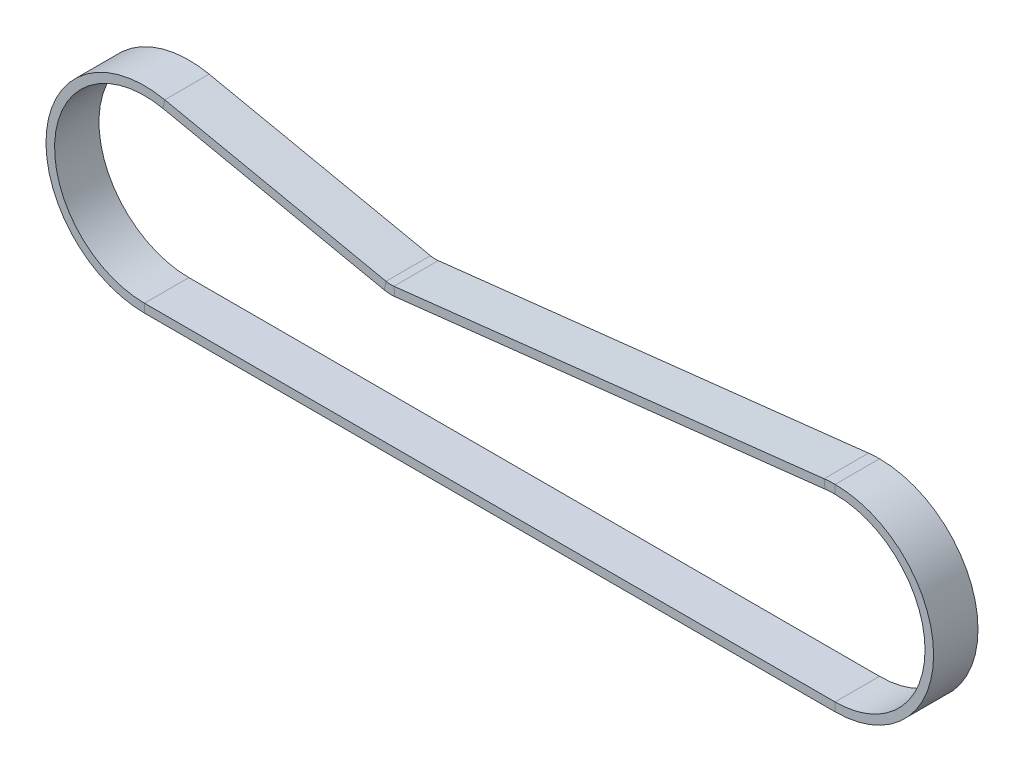
ISO-10303-21;
HEADER;
FILE_DESCRIPTION(('STEP AP214'),'2;1');
FILE_NAME('part.step','',(''),(''),'','','');
FILE_SCHEMA(('AUTOMOTIVE_DESIGN { 1 0 10303 214 1 1 1 1 }'));
ENDSEC;
DATA;
#1=APPLICATION_CONTEXT('core data for automotive mechanical design processes');
#2=APPLICATION_PROTOCOL_DEFINITION('international standard','automotive_design',2000,#1);
#3=PRODUCT_CONTEXT('',#1,'mechanical');
#4=PRODUCT('Part','Part','',(#3));
#5=PRODUCT_RELATED_PRODUCT_CATEGORY('part','',(#4));
#6=PRODUCT_DEFINITION_FORMATION('','',#4);
#7=PRODUCT_DEFINITION_CONTEXT('part definition',#1,'design');
#8=PRODUCT_DEFINITION('design','',#6,#7);
#9=PRODUCT_DEFINITION_SHAPE('','',#8);
#10=(LENGTH_UNIT() NAMED_UNIT(*) SI_UNIT(.MILLI.,.METRE.));
#11=(NAMED_UNIT(*) PLANE_ANGLE_UNIT() SI_UNIT($,.RADIAN.));
#12=(NAMED_UNIT(*) SI_UNIT($,.STERADIAN.) SOLID_ANGLE_UNIT());
#13=UNCERTAINTY_MEASURE_WITH_UNIT(LENGTH_MEASURE(1.E-05),#10,'distance_accuracy_value','');
#14=(GEOMETRIC_REPRESENTATION_CONTEXT(3) GLOBAL_UNCERTAINTY_ASSIGNED_CONTEXT((#13)) GLOBAL_UNIT_ASSIGNED_CONTEXT((#10,
#11,#12)) REPRESENTATION_CONTEXT('',''));
#15=CARTESIAN_POINT('',(0.,0.,0.));
#16=DIRECTION('',(0.,0.,1.));
#17=DIRECTION('',(1.,0.,0.));
#18=AXIS2_PLACEMENT_3D('',#15,#16,#17);
#19=CARTESIAN_POINT('',(0.,0.,0.));
#20=DIRECTION('',(0.,0.,-1.));
#21=DIRECTION('',(-1.,0.,0.));
#22=AXIS2_PLACEMENT_3D('',#19,#20,#21);
#23=CYLINDRICAL_SURFACE('',#22,18.2285931710274);
#24=CARTESIAN_POINT('',(0.,0.,4.50000000000002));
#25=DIRECTION('',(0.,0.,-1.));
#26=DIRECTION('',(-0.111807159238681,0.993729922636415,0.));
#27=AXIS2_PLACEMENT_3D('',#24,#25,#26);
#28=CIRCLE('',#27,18.2285931710274);
#29=CARTESIAN_POINT('',(-2.03808721937022,18.1142984816158,4.50000000000002));
#30=VERTEX_POINT('',#29);
#31=CARTESIAN_POINT('',(0.,18.2285931710274,4.50000000000002));
#32=VERTEX_POINT('',#31);
#33=EDGE_CURVE('E11',#30,#32,#28,.T.);
#34=ORIENTED_EDGE('',*,*,#33,.F.);
#35=DIRECTION('',(0.,0.,-1.));
#36=VECTOR('',#35,1.);
#37=CARTESIAN_POINT('',(-2.0380872193702,18.1142984816158,-4.49999999999998));
#38=LINE('',#37,#36);
#39=CARTESIAN_POINT('',(-2.03808721937022,18.1142984816158,-4.49999999999998));
#40=VERTEX_POINT('',#39);
#41=EDGE_CURVE('E42',#30,#40,#38,.T.);
#42=ORIENTED_EDGE('',*,*,#41,.T.);
#43=CARTESIAN_POINT('',(0.,0.,-4.49999999999998));
#44=DIRECTION('',(0.,0.,-1.));
#45=DIRECTION('',(-0.111807159238681,0.993729922636415,0.));
#46=AXIS2_PLACEMENT_3D('',#43,#44,#45);
#47=CIRCLE('',#46,18.2285931710274);
#48=CARTESIAN_POINT('',(0.,18.2285931710274,-4.49999999999998));
#49=VERTEX_POINT('',#48);
#50=EDGE_CURVE('E163',#40,#49,#47,.T.);
#51=ORIENTED_EDGE('',*,*,#50,.T.);
#52=DIRECTION('',(0.,0.,-1.));
#53=VECTOR('',#52,1.);
#54=CARTESIAN_POINT('',(0.,18.2285931710274,-4.49999999999998));
#55=LINE('',#54,#53);
#56=EDGE_CURVE('E166',#32,#49,#55,.T.);
#57=ORIENTED_EDGE('',*,*,#56,.F.);
#58=EDGE_LOOP('',(#34,#42,#51,#57));
#59=FACE_BOUND('',#58,.T.);
#60=ADVANCED_FACE('F39',(#59),#23,.F.);
#61=CARTESIAN_POINT('',(-2.0380872193702,18.1142984816158,4.50000000000002));
#62=DIRECTION('',(0.,0.,1.));
#63=DIRECTION('',(1.,0.,0.));
#64=AXIS2_PLACEMENT_3D('',#61,#62,#63);
#65=PLANE('',#64);
#66=CARTESIAN_POINT('',(0.,0.,4.50000000000002));
#67=DIRECTION('',(0.,0.,-1.));
#68=DIRECTION('',(-0.111807159238681,0.993729922636415,0.));
#69=AXIS2_PLACEMENT_3D('',#66,#67,#68);
#70=CIRCLE('',#69,19.9685931710274);
#71=CARTESIAN_POINT('',(-2.23263167644552,19.8433885470031,4.50000000000002));
#72=VERTEX_POINT('',#71);
#73=CARTESIAN_POINT('',(0.,19.9685931710274,4.50000000000002));
#74=VERTEX_POINT('',#73);
#75=EDGE_CURVE('E47',#72,#74,#70,.T.);
#76=ORIENTED_EDGE('',*,*,#75,.F.);
#77=DIRECTION('',(0.111807159238681,-0.993729922636415,0.));
#78=VECTOR('',#77,1.);
#79=CARTESIAN_POINT('',(-2.0380872193702,18.1142984816158,4.50000000000002));
#80=LINE('',#79,#78);
#81=EDGE_CURVE('E282',#72,#30,#80,.T.);
#82=ORIENTED_EDGE('',*,*,#81,.T.);
#83=ORIENTED_EDGE('',*,*,#33,.T.);
#84=DIRECTION('',(0.,-1.,0.));
#85=VECTOR('',#84,1.);
#86=CARTESIAN_POINT('',(0.,18.2285931710274,4.50000000000002));
#87=LINE('',#86,#85);
#88=EDGE_CURVE('E191',#74,#32,#87,.T.);
#89=ORIENTED_EDGE('',*,*,#88,.F.);
#90=EDGE_LOOP('',(#76,#82,#83,#89));
#91=FACE_BOUND('',#90,.T.);
#92=ADVANCED_FACE('F377',(#91),#65,.T.);
#93=CARTESIAN_POINT('',(0.,0.,0.));
#94=DIRECTION('',(0.,0.,-1.));
#95=DIRECTION('',(-1.,0.,0.));
#96=AXIS2_PLACEMENT_3D('',#93,#94,#95);
#97=CYLINDRICAL_SURFACE('',#96,19.9685931710274);
#98=CARTESIAN_POINT('',(0.,0.,-4.49999999999998));
#99=DIRECTION('',(0.,0.,-1.));
#100=DIRECTION('',(-0.111807159238681,0.993729922636415,0.));
#101=AXIS2_PLACEMENT_3D('',#98,#99,#100);
#102=CIRCLE('',#101,19.9685931710274);
#103=CARTESIAN_POINT('',(-2.23263167644552,19.8433885470031,-4.49999999999998));
#104=VERTEX_POINT('',#103);
#105=CARTESIAN_POINT('',(0.,19.9685931710274,-4.49999999999998));
#106=VERTEX_POINT('',#105);
#107=EDGE_CURVE('E172',#104,#106,#102,.T.);
#108=ORIENTED_EDGE('',*,*,#107,.F.);
#109=DIRECTION('',(0.,0.,1.));
#110=VECTOR('',#109,1.);
#111=CARTESIAN_POINT('',(-2.23263167644551,19.8433885470031,-4.49999999999998));
#112=LINE('',#111,#110);
#113=EDGE_CURVE('E250',#104,#72,#112,.T.);
#114=ORIENTED_EDGE('',*,*,#113,.T.);
#115=ORIENTED_EDGE('',*,*,#75,.T.);
#116=DIRECTION('',(0.,0.,1.));
#117=VECTOR('',#116,1.);
#118=CARTESIAN_POINT('',(0.,19.9685931710274,-4.49999999999998));
#119=LINE('',#118,#117);
#120=EDGE_CURVE('E195',#106,#74,#119,.T.);
#121=ORIENTED_EDGE('',*,*,#120,.F.);
#122=EDGE_LOOP('',(#108,#114,#115,#121));
#123=FACE_BOUND('',#122,.T.);
#124=ADVANCED_FACE('F381',(#123),#97,.T.);
#125=CARTESIAN_POINT('',(-89.2464197467303,8.30226032143054,-4.49999999999998));
#126=DIRECTION('',(0.111807159238681,-0.993729922636415,0.));
#127=DIRECTION('',(0.993729922636416,0.111807159238682,0.));
#128=AXIS2_PLACEMENT_3D('',#125,#126,#127);
#129=PLANE('',#128);
#130=ORIENTED_EDGE('',*,*,#41,.F.);
#131=DIRECTION('',(0.993729922636415,0.111807159238681,0.));
#132=VECTOR('',#131,1.);
#133=CARTESIAN_POINT('',(-89.2464197467303,8.30226032143054,4.50000000000002));
#134=LINE('',#133,#132);
#135=CARTESIAN_POINT('',(-89.2464197467303,8.30226032143055,4.50000000000002));
#136=VERTEX_POINT('',#135);
#137=EDGE_CURVE('E98',#136,#30,#134,.T.);
#138=ORIENTED_EDGE('',*,*,#137,.F.);
#139=DIRECTION('',(0.,0.,-1.));
#140=VECTOR('',#139,1.);
#141=CARTESIAN_POINT('',(-89.2464197467303,8.30226032143055,-4.49999999999998));
#142=LINE('',#141,#140);
#143=CARTESIAN_POINT('',(-89.2464197467303,8.30226032143055,-4.49999999999998));
#144=VERTEX_POINT('',#143);
#145=EDGE_CURVE('E253',#136,#144,#142,.T.);
#146=ORIENTED_EDGE('',*,*,#145,.T.);
#147=DIRECTION('',(0.993729922636415,0.111807159238681,0.));
#148=VECTOR('',#147,1.);
#149=CARTESIAN_POINT('',(-89.2464197467303,8.30226032143054,-4.49999999999998));
#150=LINE('',#149,#148);
#151=EDGE_CURVE('E248',#144,#40,#150,.T.);
#152=ORIENTED_EDGE('',*,*,#151,.T.);
#153=EDGE_LOOP('',(#130,#138,#146,#152));
#154=FACE_BOUND('',#153,.T.);
#155=ADVANCED_FACE('F314',(#154),#129,.T.);
#156=CARTESIAN_POINT('',(-89.2464197467303,8.30226032143054,4.50000000000002));
#157=DIRECTION('',(0.,0.,1.));
#158=DIRECTION('',(1.,0.,0.));
#159=AXIS2_PLACEMENT_3D('',#156,#157,#158);
#160=PLANE('',#159);
#161=ORIENTED_EDGE('',*,*,#137,.T.);
#162=ORIENTED_EDGE('',*,*,#81,.F.);
#163=DIRECTION('',(0.993729922636415,0.111807159238681,0.));
#164=VECTOR('',#163,1.);
#165=CARTESIAN_POINT('',(-89.4409642038056,10.0313503868179,4.50000000000002));
#166=LINE('',#165,#164);
#167=CARTESIAN_POINT('',(-89.4409642038056,10.0313503868179,4.50000000000002));
#168=VERTEX_POINT('',#167);
#169=EDGE_CURVE('E107',#168,#72,#166,.T.);
#170=ORIENTED_EDGE('',*,*,#169,.F.);
#171=DIRECTION('',(0.111807159238683,-0.993729922636415,0.));
#172=VECTOR('',#171,1.);
#173=CARTESIAN_POINT('',(-89.2464197467303,8.30226032143055,4.50000000000002));
#174=LINE('',#173,#172);
#175=EDGE_CURVE('E278',#168,#136,#174,.T.);
#176=ORIENTED_EDGE('',*,*,#175,.T.);
#177=EDGE_LOOP('',(#161,#162,#170,#176));
#178=FACE_BOUND('',#177,.T.);
#179=ADVANCED_FACE('F389',(#178),#160,.T.);
#180=CARTESIAN_POINT('',(-89.4409642038056,10.0313503868179,-4.49999999999998));
#181=DIRECTION('',(-0.111807159238681,0.993729922636415,0.));
#182=DIRECTION('',(-0.993729922636416,-0.111807159238682,0.));
#183=AXIS2_PLACEMENT_3D('',#180,#181,#182);
#184=PLANE('',#183);
#185=ORIENTED_EDGE('',*,*,#169,.T.);
#186=ORIENTED_EDGE('',*,*,#113,.F.);
#187=DIRECTION('',(0.993729922636415,0.111807159238681,0.));
#188=VECTOR('',#187,1.);
#189=CARTESIAN_POINT('',(-89.4409642038056,10.0313503868179,-4.49999999999998));
#190=LINE('',#189,#188);
#191=CARTESIAN_POINT('',(-89.4409642038056,10.0313503868179,-4.49999999999998));
#192=VERTEX_POINT('',#191);
#193=EDGE_CURVE('E115',#192,#104,#190,.T.);
#194=ORIENTED_EDGE('',*,*,#193,.F.);
#195=DIRECTION('',(0.,0.,1.));
#196=VECTOR('',#195,1.);
#197=CARTESIAN_POINT('',(-89.4409642038056,10.0313503868179,-4.49999999999998));
#198=LINE('',#197,#196);
#199=EDGE_CURVE('E242',#192,#168,#198,.T.);
#200=ORIENTED_EDGE('',*,*,#199,.T.);
#201=EDGE_LOOP('',(#185,#186,#194,#200));
#202=FACE_BOUND('',#201,.T.);
#203=ADVANCED_FACE('F405',(#202),#184,.T.);
#204=CARTESIAN_POINT('',(-89.2464197467303,8.30226032143054,-4.49999999999998));
#205=DIRECTION('',(0.,0.,-1.));
#206=DIRECTION('',(-1.,0.,0.));
#207=AXIS2_PLACEMENT_3D('',#204,#205,#206);
#208=PLANE('',#207);
#209=ORIENTED_EDGE('',*,*,#193,.T.);
#210=DIRECTION('',(-0.111807159238681,0.993729922636415,0.));
#211=VECTOR('',#210,1.);
#212=CARTESIAN_POINT('',(-2.0380872193702,18.1142984816158,-4.49999999999998));
#213=LINE('',#212,#211);
#214=EDGE_CURVE('E246',#40,#104,#213,.T.);
#215=ORIENTED_EDGE('',*,*,#214,.F.);
#216=ORIENTED_EDGE('',*,*,#151,.F.);
#217=DIRECTION('',(-0.111807159238683,0.993729922636415,0.));
#218=VECTOR('',#217,1.);
#219=CARTESIAN_POINT('',(-89.2464197467303,8.30226032143055,-4.49999999999998));
#220=LINE('',#219,#218);
#221=EDGE_CURVE('E237',#144,#192,#220,.T.);
#222=ORIENTED_EDGE('',*,*,#221,.T.);
#223=EDGE_LOOP('',(#209,#215,#216,#222));
#224=FACE_BOUND('',#223,.T.);
#225=ADVANCED_FACE('F400',(#224),#208,.T.);
#226=CARTESIAN_POINT('',(-89.999999999999,15.,0.));
#227=DIRECTION('',(0.,0.,1.));
#228=DIRECTION('',(1.,0.,0.));
#229=AXIS2_PLACEMENT_3D('',#226,#227,#228);
#230=CYLINDRICAL_SURFACE('',#229,6.74000000000001);
#231=ORIENTED_EDGE('',*,*,#145,.F.);
#232=CARTESIAN_POINT('',(-89.999999999999,15.,4.50000000000002));
#233=DIRECTION('',(0.,0.,1.));
#234=DIRECTION('',(-0.205793213304481,-0.978595500376849,0.));
#235=AXIS2_PLACEMENT_3D('',#232,#233,#234);
#236=CIRCLE('',#235,6.74000000000001);
#237=CARTESIAN_POINT('',(-91.3870462576712,8.40426632746002,4.50000000000002));
#238=VERTEX_POINT('',#237);
#239=EDGE_CURVE('E301',#238,#136,#236,.T.);
#240=ORIENTED_EDGE('',*,*,#239,.F.);
#241=DIRECTION('',(0.,0.,-1.));
#242=VECTOR('',#241,1.);
#243=CARTESIAN_POINT('',(-91.3870462576712,8.40426632746002,-4.49999999999998));
#244=LINE('',#243,#242);
#245=CARTESIAN_POINT('',(-91.3870462576712,8.40426632746002,-4.49999999999998));
#246=VERTEX_POINT('',#245);
#247=EDGE_CURVE('E245',#238,#246,#244,.T.);
#248=ORIENTED_EDGE('',*,*,#247,.T.);
#249=CARTESIAN_POINT('',(-89.999999999999,15.,-4.49999999999998));
#250=DIRECTION('',(0.,0.,1.));
#251=DIRECTION('',(-0.205793213304481,-0.978595500376849,0.));
#252=AXIS2_PLACEMENT_3D('',#249,#250,#251);
#253=CIRCLE('',#252,6.74000000000001);
#254=EDGE_CURVE('E240',#246,#144,#253,.T.);
#255=ORIENTED_EDGE('',*,*,#254,.T.);
#256=EDGE_LOOP('',(#231,#240,#248,#255));
#257=FACE_BOUND('',#256,.T.);
#258=ADVANCED_FACE('F319',(#257),#230,.T.);
#259=CARTESIAN_POINT('',(-91.3870462576712,8.40426632746002,4.50000000000002));
#260=DIRECTION('',(0.,0.,1.));
#261=DIRECTION('',(1.,0.,0.));
#262=AXIS2_PLACEMENT_3D('',#259,#260,#261);
#263=PLANE('',#262);
#264=ORIENTED_EDGE('',*,*,#239,.T.);
#265=ORIENTED_EDGE('',*,*,#175,.F.);
#266=CARTESIAN_POINT('',(-89.999999999999,15.,4.50000000000002));
#267=DIRECTION('',(0.,0.,1.));
#268=DIRECTION('',(-0.205793213304481,-0.978595500376849,0.));
#269=AXIS2_PLACEMENT_3D('',#266,#267,#268);
#270=CIRCLE('',#269,5.00000000000001);
#271=CARTESIAN_POINT('',(-91.0289660665214,10.1070224981157,4.50000000000002));
#272=VERTEX_POINT('',#271);
#273=EDGE_CURVE('E136',#272,#168,#270,.T.);
#274=ORIENTED_EDGE('',*,*,#273,.F.);
#275=DIRECTION('',(-0.205793213304481,-0.978595500376849,0.));
#276=VECTOR('',#275,1.);
#277=CARTESIAN_POINT('',(-91.3870462576712,8.40426632746002,4.50000000000002));
#278=LINE('',#277,#276);
#279=EDGE_CURVE('E275',#272,#238,#278,.T.);
#280=ORIENTED_EDGE('',*,*,#279,.T.);
#281=EDGE_LOOP('',(#264,#265,#274,#280));
#282=FACE_BOUND('',#281,.T.);
#283=ADVANCED_FACE('F399',(#282),#263,.T.);
#284=CARTESIAN_POINT('',(-89.999999999999,15.,0.));
#285=DIRECTION('',(0.,0.,1.));
#286=DIRECTION('',(1.,0.,0.));
#287=AXIS2_PLACEMENT_3D('',#284,#285,#286);
#288=CYLINDRICAL_SURFACE('',#287,5.00000000000001);
#289=ORIENTED_EDGE('',*,*,#273,.T.);
#290=ORIENTED_EDGE('',*,*,#199,.F.);
#291=CARTESIAN_POINT('',(-89.999999999999,15.,-4.49999999999998));
#292=DIRECTION('',(0.,0.,1.));
#293=DIRECTION('',(-0.205793213304481,-0.978595500376849,0.));
#294=AXIS2_PLACEMENT_3D('',#291,#292,#293);
#295=CIRCLE('',#294,5.00000000000001);
#296=CARTESIAN_POINT('',(-91.0289660665214,10.1070224981157,-4.49999999999998));
#297=VERTEX_POINT('',#296);
#298=EDGE_CURVE('E142',#297,#192,#295,.T.);
#299=ORIENTED_EDGE('',*,*,#298,.F.);
#300=DIRECTION('',(0.,0.,1.));
#301=VECTOR('',#300,1.);
#302=CARTESIAN_POINT('',(-91.0289660665214,10.1070224981157,-4.49999999999998));
#303=LINE('',#302,#301);
#304=EDGE_CURVE('E233',#297,#272,#303,.T.);
#305=ORIENTED_EDGE('',*,*,#304,.T.);
#306=EDGE_LOOP('',(#289,#290,#299,#305));
#307=FACE_BOUND('',#306,.T.);
#308=ADVANCED_FACE('F410',(#307),#288,.F.);
#309=CARTESIAN_POINT('',(-91.3870462576712,8.40426632746002,-4.49999999999998));
#310=DIRECTION('',(0.,0.,-1.));
#311=DIRECTION('',(-1.,0.,0.));
#312=AXIS2_PLACEMENT_3D('',#309,#310,#311);
#313=PLANE('',#312);
#314=ORIENTED_EDGE('',*,*,#298,.T.);
#315=ORIENTED_EDGE('',*,*,#221,.F.);
#316=ORIENTED_EDGE('',*,*,#254,.F.);
#317=DIRECTION('',(0.205793213304481,0.978595500376849,0.));
#318=VECTOR('',#317,1.);
#319=CARTESIAN_POINT('',(-91.3870462576712,8.40426632746002,-4.49999999999998));
#320=LINE('',#319,#318);
#321=EDGE_CURVE('E226',#246,#297,#320,.T.);
#322=ORIENTED_EDGE('',*,*,#321,.T.);
#323=EDGE_LOOP('',(#314,#315,#316,#322));
#324=FACE_BOUND('',#323,.T.);
#325=ADVANCED_FACE('F317',(#324),#313,.T.);
#326=CARTESIAN_POINT('',(-136.248679237129,17.838419255175,-4.49999999999998));
#327=DIRECTION('',(-0.205793213304481,-0.978595500376849,0.));
#328=DIRECTION('',(0.97859550037685,-0.205793213304481,0.));
#329=AXIS2_PLACEMENT_3D('',#326,#327,#328);
#330=PLANE('',#329);
#331=ORIENTED_EDGE('',*,*,#247,.F.);
#332=DIRECTION('',(0.978595500376849,-0.205793213304481,0.));
#333=VECTOR('',#332,1.);
#334=CARTESIAN_POINT('',(-136.248679237129,17.838419255175,4.50000000000002));
#335=LINE('',#334,#333);
#336=CARTESIAN_POINT('',(-136.248679237129,17.838419255175,4.50000000000002));
#337=VERTEX_POINT('',#336);
#338=EDGE_CURVE('E297',#337,#238,#335,.T.);
#339=ORIENTED_EDGE('',*,*,#338,.F.);
#340=DIRECTION('',(0.,0.,-1.));
#341=VECTOR('',#340,1.);
#342=CARTESIAN_POINT('',(-136.248679237129,17.838419255175,-4.49999999999998));
#343=LINE('',#342,#341);
#344=CARTESIAN_POINT('',(-136.248679237129,17.838419255175,-4.49999999999998));
#345=VERTEX_POINT('',#344);
#346=EDGE_CURVE('E236',#337,#345,#343,.T.);
#347=ORIENTED_EDGE('',*,*,#346,.T.);
#348=DIRECTION('',(0.978595500376849,-0.205793213304481,0.));
#349=VECTOR('',#348,1.);
#350=CARTESIAN_POINT('',(-136.248679237129,17.838419255175,-4.49999999999998));
#351=LINE('',#350,#349);
#352=EDGE_CURVE('E230',#345,#246,#351,.T.);
#353=ORIENTED_EDGE('',*,*,#352,.T.);
#354=EDGE_LOOP('',(#331,#339,#347,#353));
#355=FACE_BOUND('',#354,.T.);
#356=ADVANCED_FACE('F328',(#355),#330,.T.);
#357=CARTESIAN_POINT('',(-136.248679237129,17.838419255175,4.50000000000002));
#358=DIRECTION('',(0.,0.,1.));
#359=DIRECTION('',(1.,0.,0.));
#360=AXIS2_PLACEMENT_3D('',#357,#358,#359);
#361=PLANE('',#360);
#362=ORIENTED_EDGE('',*,*,#338,.T.);
#363=ORIENTED_EDGE('',*,*,#279,.F.);
#364=DIRECTION('',(0.978595500376849,-0.205793213304481,0.));
#365=VECTOR('',#364,1.);
#366=CARTESIAN_POINT('',(-135.89059904598,19.5411754258307,4.50000000000002));
#367=LINE('',#366,#365);
#368=CARTESIAN_POINT('',(-135.89059904598,19.5411754258307,4.50000000000002));
#369=VERTEX_POINT('',#368);
#370=EDGE_CURVE('E272',#369,#272,#367,.T.);
#371=ORIENTED_EDGE('',*,*,#370,.F.);
#372=DIRECTION('',(-0.205793213304482,-0.978595500376849,0.));
#373=VECTOR('',#372,1.);
#374=CARTESIAN_POINT('',(-136.248679237129,17.838419255175,4.50000000000002));
#375=LINE('',#374,#373);
#376=EDGE_CURVE('E269',#369,#337,#375,.T.);
#377=ORIENTED_EDGE('',*,*,#376,.T.);
#378=EDGE_LOOP('',(#362,#363,#371,#377));
#379=FACE_BOUND('',#378,.T.);
#380=ADVANCED_FACE('F346',(#379),#361,.T.);
#381=CARTESIAN_POINT('',(-135.89059904598,19.5411754258307,-4.49999999999998));
#382=DIRECTION('',(0.205793213304481,0.978595500376849,0.));
#383=DIRECTION('',(-0.97859550037685,0.205793213304481,0.));
#384=AXIS2_PLACEMENT_3D('',#381,#382,#383);
#385=PLANE('',#384);
#386=ORIENTED_EDGE('',*,*,#370,.T.);
#387=ORIENTED_EDGE('',*,*,#304,.F.);
#388=DIRECTION('',(0.978595500376849,-0.205793213304481,0.));
#389=VECTOR('',#388,1.);
#390=CARTESIAN_POINT('',(-135.89059904598,19.5411754258307,-4.49999999999998));
#391=LINE('',#390,#389);
#392=CARTESIAN_POINT('',(-135.89059904598,19.5411754258307,-4.49999999999998));
#393=VERTEX_POINT('',#392);
#394=EDGE_CURVE('E229',#393,#297,#391,.T.);
#395=ORIENTED_EDGE('',*,*,#394,.F.);
#396=DIRECTION('',(0.,0.,1.));
#397=VECTOR('',#396,1.);
#398=CARTESIAN_POINT('',(-135.89059904598,19.5411754258307,-4.49999999999998));
#399=LINE('',#398,#397);
#400=EDGE_CURVE('E218',#393,#369,#399,.T.);
#401=ORIENTED_EDGE('',*,*,#400,.T.);
#402=EDGE_LOOP('',(#386,#387,#395,#401));
#403=FACE_BOUND('',#402,.T.);
#404=ADVANCED_FACE('F339',(#403),#385,.T.);
#405=CARTESIAN_POINT('',(-136.248679237129,17.838419255175,-4.49999999999998));
#406=DIRECTION('',(0.,0.,-1.));
#407=DIRECTION('',(-1.,0.,0.));
#408=AXIS2_PLACEMENT_3D('',#405,#406,#407);
#409=PLANE('',#408);
#410=ORIENTED_EDGE('',*,*,#394,.T.);
#411=ORIENTED_EDGE('',*,*,#321,.F.);
#412=ORIENTED_EDGE('',*,*,#352,.F.);
#413=DIRECTION('',(0.205793213304482,0.978595500376849,0.));
#414=VECTOR('',#413,1.);
#415=CARTESIAN_POINT('',(-136.248679237129,17.838419255175,-4.49999999999998));
#416=LINE('',#415,#414);
#417=EDGE_CURVE('E215',#345,#393,#416,.T.);
#418=ORIENTED_EDGE('',*,*,#417,.T.);
#419=EDGE_LOOP('',(#410,#411,#412,#418));
#420=FACE_BOUND('',#419,.T.);
#421=ADVANCED_FACE('F326',(#420),#409,.T.);
#422=CARTESIAN_POINT('',(-139.999999999815,-1.92601436107796E-10,0.));
#423=DIRECTION('',(0.,0.,-1.));
#424=DIRECTION('',(-1.,0.,0.));
#425=AXIS2_PLACEMENT_3D('',#422,#423,#424);
#426=CYLINDRICAL_SURFACE('',#425,18.2285931710274);
#427=ORIENTED_EDGE('',*,*,#346,.F.);
#428=CARTESIAN_POINT('',(-139.999999999815,-1.92601436107796E-10,4.50000000000002));
#429=DIRECTION('',(0.,0.,-1.));
#430=DIRECTION('',(1.37646608935287E-12,-1.,0.));
#431=AXIS2_PLACEMENT_3D('',#428,#429,#430);
#432=CIRCLE('',#431,18.2285931710274);
#433=CARTESIAN_POINT('',(-139.99999999979,-18.22859317122,4.50000000000002));
#434=VERTEX_POINT('',#433);
#435=EDGE_CURVE('E219',#434,#337,#432,.T.);
#436=ORIENTED_EDGE('',*,*,#435,.F.);
#437=DIRECTION('',(0.,0.,-1.));
#438=VECTOR('',#437,1.);
#439=CARTESIAN_POINT('',(-139.99999999979,-18.22859317122,-4.49999999999998));
#440=LINE('',#439,#438);
#441=CARTESIAN_POINT('',(-139.99999999979,-18.22859317122,-4.49999999999998));
#442=VERTEX_POINT('',#441);
#443=EDGE_CURVE('E225',#434,#442,#440,.T.);
#444=ORIENTED_EDGE('',*,*,#443,.T.);
#445=CARTESIAN_POINT('',(-139.999999999815,-1.92601436107796E-10,-4.49999999999998));
#446=DIRECTION('',(0.,0.,-1.));
#447=DIRECTION('',(1.37646608935287E-12,-1.,0.));
#448=AXIS2_PLACEMENT_3D('',#445,#446,#447);
#449=CIRCLE('',#448,18.2285931710274);
#450=EDGE_CURVE('E223',#442,#345,#449,.T.);
#451=ORIENTED_EDGE('',*,*,#450,.T.);
#452=EDGE_LOOP('',(#427,#436,#444,#451));
#453=FACE_BOUND('',#452,.T.);
#454=ADVANCED_FACE('F349',(#453),#426,.F.);
#455=CARTESIAN_POINT('',(-139.99999999979,-18.22859317122,4.50000000000002));
#456=DIRECTION('',(0.,0.,1.));
#457=DIRECTION('',(1.,0.,0.));
#458=AXIS2_PLACEMENT_3D('',#455,#456,#457);
#459=PLANE('',#458);
#460=ORIENTED_EDGE('',*,*,#435,.T.);
#461=ORIENTED_EDGE('',*,*,#376,.F.);
#462=CARTESIAN_POINT('',(-139.999999999815,-1.92601436107796E-10,4.50000000000002));
#463=DIRECTION('',(0.,0.,-1.));
#464=DIRECTION('',(1.37606187997964E-12,-1.,0.));
#465=AXIS2_PLACEMENT_3D('',#462,#463,#464);
#466=CIRCLE('',#465,19.9685931710274);
#467=CARTESIAN_POINT('',(-139.999999999788,-19.96859317122,4.50000000000002));
#468=VERTEX_POINT('',#467);
#469=EDGE_CURVE('E222',#468,#369,#466,.T.);
#470=ORIENTED_EDGE('',*,*,#469,.F.);
#471=DIRECTION('',(-1.37550158295944E-12,1.,0.));
#472=VECTOR('',#471,1.);
#473=CARTESIAN_POINT('',(-139.99999999979,-18.22859317122,4.50000000000002));
#474=LINE('',#473,#472);
#475=EDGE_CURVE('E266',#468,#434,#474,.T.);
#476=ORIENTED_EDGE('',*,*,#475,.T.);
#477=EDGE_LOOP('',(#460,#461,#470,#476));
#478=FACE_BOUND('',#477,.T.);
#479=ADVANCED_FACE('F347',(#478),#459,.T.);
#480=CARTESIAN_POINT('',(-139.999999999815,-1.92601436107796E-10,0.));
#481=DIRECTION('',(0.,0.,-1.));
#482=DIRECTION('',(-1.,0.,0.));
#483=AXIS2_PLACEMENT_3D('',#480,#481,#482);
#484=CYLINDRICAL_SURFACE('',#483,19.9685931710274);
#485=ORIENTED_EDGE('',*,*,#469,.T.);
#486=ORIENTED_EDGE('',*,*,#400,.F.);
#487=CARTESIAN_POINT('',(-139.999999999815,-1.92601436107796E-10,-4.49999999999998));
#488=DIRECTION('',(0.,0.,-1.));
#489=DIRECTION('',(1.37606187997964E-12,-1.,0.));
#490=AXIS2_PLACEMENT_3D('',#487,#488,#489);
#491=CIRCLE('',#490,19.9685931710274);
#492=CARTESIAN_POINT('',(-139.999999999788,-19.96859317122,-4.49999999999998));
#493=VERTEX_POINT('',#492);
#494=EDGE_CURVE('E220',#493,#393,#491,.T.);
#495=ORIENTED_EDGE('',*,*,#494,.F.);
#496=DIRECTION('',(0.,0.,1.));
#497=VECTOR('',#496,1.);
#498=CARTESIAN_POINT('',(-139.999999999788,-19.96859317122,-4.49999999999998));
#499=LINE('',#498,#497);
#500=EDGE_CURVE('E211',#493,#468,#499,.T.);
#501=ORIENTED_EDGE('',*,*,#500,.T.);
#502=EDGE_LOOP('',(#485,#486,#495,#501));
#503=FACE_BOUND('',#502,.T.);
#504=ADVANCED_FACE('F340',(#503),#484,.T.);
#505=CARTESIAN_POINT('',(-139.99999999979,-18.22859317122,-4.49999999999998));
#506=DIRECTION('',(0.,0.,-1.));
#507=DIRECTION('',(-1.,0.,0.));
#508=AXIS2_PLACEMENT_3D('',#505,#506,#507);
#509=PLANE('',#508);
#510=ORIENTED_EDGE('',*,*,#494,.T.);
#511=ORIENTED_EDGE('',*,*,#417,.F.);
#512=ORIENTED_EDGE('',*,*,#450,.F.);
#513=DIRECTION('',(1.37550158295944E-12,-1.,0.));
#514=VECTOR('',#513,1.);
#515=CARTESIAN_POINT('',(-139.99999999979,-18.22859317122,-4.49999999999998));
#516=LINE('',#515,#514);
#517=EDGE_CURVE('E204',#442,#493,#516,.T.);
#518=ORIENTED_EDGE('',*,*,#517,.T.);
#519=EDGE_LOOP('',(#510,#511,#512,#518));
#520=FACE_BOUND('',#519,.T.);
#521=ADVANCED_FACE('F333',(#520),#509,.T.);
#522=CARTESIAN_POINT('',(2.50734587618718E-11,-18.2285931710274,-4.49999999999998));
#523=DIRECTION('',(-1.37568527997931E-12,1.,0.));
#524=DIRECTION('',(-1.,-1.37568527997931E-12,0.));
#525=AXIS2_PLACEMENT_3D('',#522,#523,#524);
#526=PLANE('',#525);
#527=ORIENTED_EDGE('',*,*,#443,.F.);
#528=DIRECTION('',(-1.,-1.37568527997931E-12,0.));
#529=VECTOR('',#528,1.);
#530=CARTESIAN_POINT('',(2.50734587618718E-11,-18.2285931710274,4.50000000000002));
#531=LINE('',#530,#529);
#532=CARTESIAN_POINT('',(2.50890140050894E-11,-18.2285931710274,4.50000000000002));
#533=VERTEX_POINT('',#532);
#534=EDGE_CURVE('E290',#533,#434,#531,.T.);
#535=ORIENTED_EDGE('',*,*,#534,.F.);
#536=DIRECTION('',(0.,0.,-1.));
#537=VECTOR('',#536,1.);
#538=CARTESIAN_POINT('',(2.50926444089715E-11,-18.2285931710274,-4.49999999999998));
#539=LINE('',#538,#537);
#540=CARTESIAN_POINT('',(2.50890140050894E-11,-18.2285931710274,-4.49999999999998));
#541=VERTEX_POINT('',#540);
#542=EDGE_CURVE('E214',#533,#541,#539,.T.);
#543=ORIENTED_EDGE('',*,*,#542,.T.);
#544=DIRECTION('',(-1.,-1.37568527997931E-12,0.));
#545=VECTOR('',#544,1.);
#546=CARTESIAN_POINT('',(2.50734587618718E-11,-18.2285931710274,-4.49999999999998));
#547=LINE('',#546,#545);
#548=EDGE_CURVE('E208',#541,#442,#547,.T.);
#549=ORIENTED_EDGE('',*,*,#548,.T.);
#550=EDGE_LOOP('',(#527,#535,#543,#549));
#551=FACE_BOUND('',#550,.T.);
#552=ADVANCED_FACE('F351',(#551),#526,.T.);
#553=CARTESIAN_POINT('',(2.50734587618718E-11,-18.2285931710274,4.50000000000002));
#554=DIRECTION('',(0.,0.,1.));
#555=DIRECTION('',(1.,0.,0.));
#556=AXIS2_PLACEMENT_3D('',#553,#554,#555);
#557=PLANE('',#556);
#558=ORIENTED_EDGE('',*,*,#534,.T.);
#559=ORIENTED_EDGE('',*,*,#475,.F.);
#560=DIRECTION('',(-1.,-1.37568527997931E-12,0.));
#561=VECTOR('',#560,1.);
#562=CARTESIAN_POINT('',(2.74668315162212E-11,-19.9685931710274,4.50000000000002));
#563=LINE('',#562,#561);
#564=CARTESIAN_POINT('',(2.74838715763386E-11,-19.9685931710274,4.50000000000002));
#565=VERTEX_POINT('',#564);
#566=EDGE_CURVE('E263',#565,#468,#563,.T.);
#567=ORIENTED_EDGE('',*,*,#566,.F.);
#568=DIRECTION('',(-1.37655408585528E-12,1.,0.));
#569=VECTOR('',#568,1.);
#570=CARTESIAN_POINT('',(2.50926444089715E-11,-18.2285931710274,4.50000000000002));
#571=LINE('',#570,#569);
#572=EDGE_CURVE('E260',#565,#533,#571,.T.);
#573=ORIENTED_EDGE('',*,*,#572,.T.);
#574=EDGE_LOOP('',(#558,#559,#567,#573));
#575=FACE_BOUND('',#574,.T.);
#576=ADVANCED_FACE('F353',(#575),#557,.T.);
#577=CARTESIAN_POINT('',(2.74668315162212E-11,-19.9685931710274,-4.49999999999998));
#578=DIRECTION('',(1.37568527997931E-12,-1.,0.));
#579=DIRECTION('',(1.,1.37568527997931E-12,0.));
#580=AXIS2_PLACEMENT_3D('',#577,#578,#579);
#581=PLANE('',#580);
#582=ORIENTED_EDGE('',*,*,#566,.T.);
#583=ORIENTED_EDGE('',*,*,#500,.F.);
#584=DIRECTION('',(-1.,-1.37568527997931E-12,0.));
#585=VECTOR('',#584,1.);
#586=CARTESIAN_POINT('',(2.74668315162212E-11,-19.9685931710274,-4.49999999999998));
#587=LINE('',#586,#585);
#588=CARTESIAN_POINT('',(2.74838715763386E-11,-19.9685931710274,-4.49999999999998));
#589=VERTEX_POINT('',#588);
#590=EDGE_CURVE('E207',#589,#493,#587,.T.);
#591=ORIENTED_EDGE('',*,*,#590,.F.);
#592=DIRECTION('',(0.,0.,1.));
#593=VECTOR('',#592,1.);
#594=CARTESIAN_POINT('',(2.74878485183596E-11,-19.9685931710274,-4.49999999999998));
#595=LINE('',#594,#593);
#596=EDGE_CURVE('E202',#589,#565,#595,.T.);
#597=ORIENTED_EDGE('',*,*,#596,.T.);
#598=EDGE_LOOP('',(#582,#583,#591,#597));
#599=FACE_BOUND('',#598,.T.);
#600=ADVANCED_FACE('F363',(#599),#581,.T.);
#601=CARTESIAN_POINT('',(2.50734587618718E-11,-18.2285931710274,-4.49999999999998));
#602=DIRECTION('',(0.,0.,-1.));
#603=DIRECTION('',(-1.,0.,0.));
#604=AXIS2_PLACEMENT_3D('',#601,#602,#603);
#605=PLANE('',#604);
#606=ORIENTED_EDGE('',*,*,#590,.T.);
#607=ORIENTED_EDGE('',*,*,#517,.F.);
#608=ORIENTED_EDGE('',*,*,#548,.F.);
#609=DIRECTION('',(1.37655408585528E-12,-1.,0.));
#610=VECTOR('',#609,1.);
#611=CARTESIAN_POINT('',(2.50926444089715E-11,-18.2285931710274,-4.49999999999998));
#612=LINE('',#611,#610);
#613=EDGE_CURVE('E183',#541,#589,#612,.T.);
#614=ORIENTED_EDGE('',*,*,#613,.T.);
#615=EDGE_LOOP('',(#606,#607,#608,#614));
#616=FACE_BOUND('',#615,.T.);
#617=ADVANCED_FACE('F365',(#616),#605,.T.);
#618=CARTESIAN_POINT('',(0.,0.,0.));
#619=DIRECTION('',(0.,0.,-1.));
#620=DIRECTION('',(-1.,0.,0.));
#621=AXIS2_PLACEMENT_3D('',#618,#619,#620);
#622=CYLINDRICAL_SURFACE('',#621,18.2285931710274);
#623=ORIENTED_EDGE('',*,*,#542,.F.);
#624=CARTESIAN_POINT('',(0.,0.,4.50000000000002));
#625=DIRECTION('',(0.,0.,-1.));
#626=DIRECTION('',(0.,1.,0.));
#627=AXIS2_PLACEMENT_3D('',#624,#625,#626);
#628=CIRCLE('',#627,18.2285931710274);
#629=EDGE_CURVE('E190',#32,#533,#628,.T.);
#630=ORIENTED_EDGE('',*,*,#629,.F.);
#631=ORIENTED_EDGE('',*,*,#56,.T.);
#632=CARTESIAN_POINT('',(0.,0.,-4.49999999999998));
#633=DIRECTION('',(0.,0.,-1.));
#634=DIRECTION('',(0.,1.,0.));
#635=AXIS2_PLACEMENT_3D('',#632,#633,#634);
#636=CIRCLE('',#635,18.2285931710274);
#637=EDGE_CURVE('E178',#49,#541,#636,.T.);
#638=ORIENTED_EDGE('',*,*,#637,.T.);
#639=EDGE_LOOP('',(#623,#630,#631,#638));
#640=FACE_BOUND('',#639,.T.);
#641=ADVANCED_FACE('F188',(#640),#622,.F.);
#642=CARTESIAN_POINT('',(0.,18.2285931710274,4.50000000000002));
#643=DIRECTION('',(0.,0.,1.));
#644=DIRECTION('',(1.,0.,0.));
#645=AXIS2_PLACEMENT_3D('',#642,#643,#644);
#646=PLANE('',#645);
#647=ORIENTED_EDGE('',*,*,#629,.T.);
#648=ORIENTED_EDGE('',*,*,#572,.F.);
#649=CARTESIAN_POINT('',(0.,0.,4.50000000000002));
#650=DIRECTION('',(0.,0.,-1.));
#651=DIRECTION('',(0.,1.,0.));
#652=AXIS2_PLACEMENT_3D('',#649,#650,#651);
#653=CIRCLE('',#652,19.9685931710274);
#654=EDGE_CURVE('E257',#74,#565,#653,.T.);
#655=ORIENTED_EDGE('',*,*,#654,.F.);
#656=ORIENTED_EDGE('',*,*,#88,.T.);
#657=EDGE_LOOP('',(#647,#648,#655,#656));
#658=FACE_BOUND('',#657,.T.);
#659=ADVANCED_FACE('F357',(#658),#646,.T.);
#660=CARTESIAN_POINT('',(0.,0.,0.));
#661=DIRECTION('',(0.,0.,-1.));
#662=DIRECTION('',(-1.,0.,0.));
#663=AXIS2_PLACEMENT_3D('',#660,#661,#662);
#664=CYLINDRICAL_SURFACE('',#663,19.9685931710274);
#665=ORIENTED_EDGE('',*,*,#654,.T.);
#666=ORIENTED_EDGE('',*,*,#596,.F.);
#667=CARTESIAN_POINT('',(0.,0.,-4.49999999999998));
#668=DIRECTION('',(0.,0.,-1.));
#669=DIRECTION('',(0.,1.,0.));
#670=AXIS2_PLACEMENT_3D('',#667,#668,#669);
#671=CIRCLE('',#670,19.9685931710274);
#672=EDGE_CURVE('E201',#106,#589,#671,.T.);
#673=ORIENTED_EDGE('',*,*,#672,.F.);
#674=ORIENTED_EDGE('',*,*,#120,.T.);
#675=EDGE_LOOP('',(#665,#666,#673,#674));
#676=FACE_BOUND('',#675,.T.);
#677=ADVANCED_FACE('F360',(#676),#664,.T.);
#678=CARTESIAN_POINT('',(0.,18.2285931710274,-4.49999999999998));
#679=DIRECTION('',(0.,0.,-1.));
#680=DIRECTION('',(-1.,0.,0.));
#681=AXIS2_PLACEMENT_3D('',#678,#679,#680);
#682=PLANE('',#681);
#683=ORIENTED_EDGE('',*,*,#672,.T.);
#684=ORIENTED_EDGE('',*,*,#613,.F.);
#685=ORIENTED_EDGE('',*,*,#637,.F.);
#686=DIRECTION('',(0.,1.,0.));
#687=VECTOR('',#686,1.);
#688=CARTESIAN_POINT('',(0.,18.2285931710274,-4.49999999999998));
#689=LINE('',#688,#687);
#690=EDGE_CURVE('E181',#49,#106,#689,.T.);
#691=ORIENTED_EDGE('',*,*,#690,.T.);
#692=EDGE_LOOP('',(#683,#684,#685,#691));
#693=FACE_BOUND('',#692,.T.);
#694=ADVANCED_FACE('F180',(#693),#682,.T.);
#695=CARTESIAN_POINT('',(-2.0380872193702,18.1142984816158,-4.49999999999998));
#696=DIRECTION('',(0.,0.,-1.));
#697=DIRECTION('',(-1.,0.,0.));
#698=AXIS2_PLACEMENT_3D('',#695,#696,#697);
#699=PLANE('',#698);
#700=ORIENTED_EDGE('',*,*,#214,.T.);
#701=ORIENTED_EDGE('',*,*,#107,.T.);
#702=ORIENTED_EDGE('',*,*,#690,.F.);
#703=ORIENTED_EDGE('',*,*,#50,.F.);
#704=EDGE_LOOP('',(#700,#701,#702,#703));
#705=FACE_BOUND('',#704,.T.);
#706=ADVANCED_FACE('F193',(#705),#699,.T.);
#707=CLOSED_SHELL('',(#60,#92,#124,#155,#179,#203,#225,#258,#283,#308,#325,#356,#380,#404,#421,
#454,#479,#504,#521,#552,#576,#600,#617,#641,#659,#677,#694,#706));
#708=MANIFOLD_SOLID_BREP('B2',#707);
#709=ADVANCED_BREP_SHAPE_REPRESENTATION('',(#18,#708),#14);
#710=SHAPE_DEFINITION_REPRESENTATION(#9,#709);
ENDSEC;
END-ISO-10303-21;
